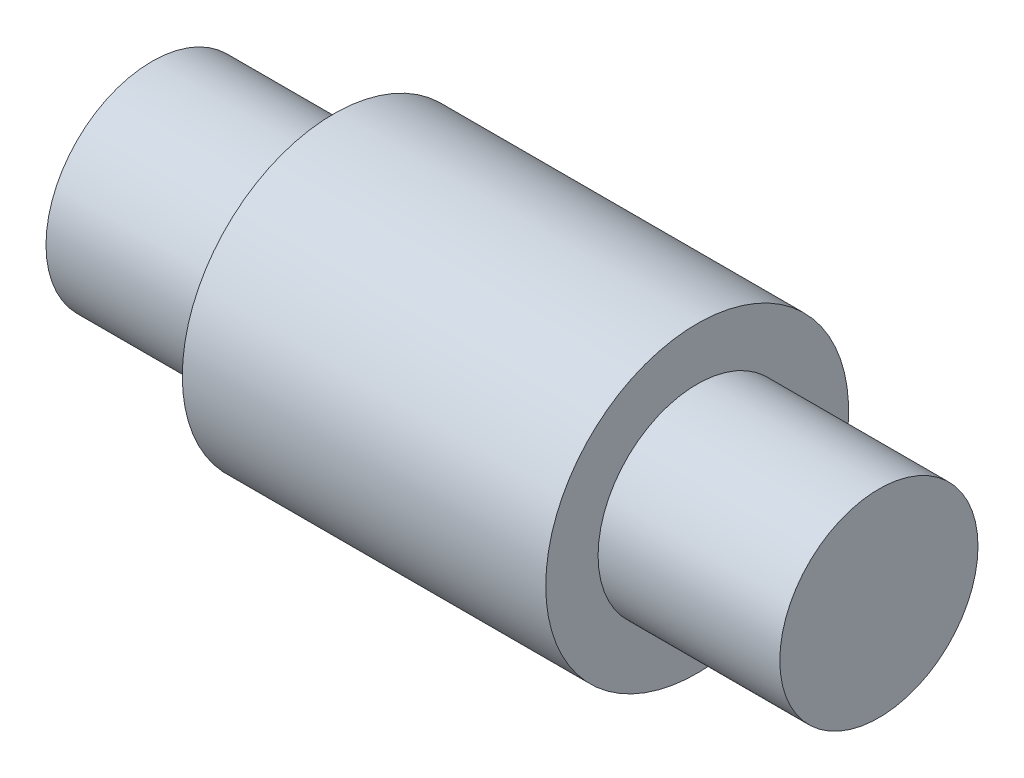
ISO-10303-21;
HEADER;
FILE_DESCRIPTION(('STEP AP214'),'2;1');
FILE_NAME('part.step','',(''),(''),'','','');
FILE_SCHEMA(('AUTOMOTIVE_DESIGN { 1 0 10303 214 1 1 1 1 }'));
ENDSEC;
DATA;
#1=APPLICATION_CONTEXT('core data for automotive mechanical design processes');
#2=APPLICATION_PROTOCOL_DEFINITION('international standard','automotive_design',2000,#1);
#3=PRODUCT_CONTEXT('',#1,'mechanical');
#4=PRODUCT('Part','Part','',(#3));
#5=PRODUCT_RELATED_PRODUCT_CATEGORY('part','',(#4));
#6=PRODUCT_DEFINITION_FORMATION('','',#4);
#7=PRODUCT_DEFINITION_CONTEXT('part definition',#1,'design');
#8=PRODUCT_DEFINITION('design','',#6,#7);
#9=PRODUCT_DEFINITION_SHAPE('','',#8);
#10=(LENGTH_UNIT() NAMED_UNIT(*) SI_UNIT(.MILLI.,.METRE.));
#11=(NAMED_UNIT(*) PLANE_ANGLE_UNIT() SI_UNIT($,.RADIAN.));
#12=(NAMED_UNIT(*) SI_UNIT($,.STERADIAN.) SOLID_ANGLE_UNIT());
#13=UNCERTAINTY_MEASURE_WITH_UNIT(LENGTH_MEASURE(1.E-05),#10,'distance_accuracy_value','');
#14=(GEOMETRIC_REPRESENTATION_CONTEXT(3) GLOBAL_UNCERTAINTY_ASSIGNED_CONTEXT((#13)) GLOBAL_UNIT_ASSIGNED_CONTEXT((#10,
#11,#12)) REPRESENTATION_CONTEXT('',''));
#15=CARTESIAN_POINT('',(0.,0.,0.));
#16=DIRECTION('',(0.,0.,1.));
#17=DIRECTION('',(1.,0.,0.));
#18=AXIS2_PLACEMENT_3D('',#15,#16,#17);
#19=CARTESIAN_POINT('',(-12.,0.,0.));
#20=DIRECTION('',(-1.,0.,0.));
#21=DIRECTION('',(0.,0.,1.));
#22=AXIS2_PLACEMENT_3D('',#19,#20,#21);
#23=CYLINDRICAL_SURFACE('',#22,5.);
#24=CARTESIAN_POINT('',(-6.,0.,0.));
#25=DIRECTION('',(-1.,0.,0.));
#26=DIRECTION('',(0.,0.,1.));
#27=AXIS2_PLACEMENT_3D('',#24,#25,#26);
#28=CIRCLE('',#27,5.);
#29=CARTESIAN_POINT('',(-6.,0.,5.));
#30=VERTEX_POINT('',#29);
#31=EDGE_CURVE('E56',#30,#30,#28,.T.);
#32=ORIENTED_EDGE('',*,*,#31,.F.);
#33=EDGE_LOOP('',(#32));
#34=FACE_BOUND('',#33,.T.);
#35=CARTESIAN_POINT('',(6.,0.,0.));
#36=DIRECTION('',(-1.,0.,0.));
#37=DIRECTION('',(0.,0.,1.));
#38=AXIS2_PLACEMENT_3D('',#35,#36,#37);
#39=CIRCLE('',#38,5.);
#40=CARTESIAN_POINT('',(6.,0.,5.));
#41=VERTEX_POINT('',#40);
#42=EDGE_CURVE('E10',#41,#41,#39,.T.);
#43=ORIENTED_EDGE('',*,*,#42,.T.);
#44=EDGE_LOOP('',(#43));
#45=FACE_BOUND('',#44,.T.);
#46=ADVANCED_FACE('F40',(#34,#45),#23,.T.);
#47=CARTESIAN_POINT('',(6.,5.,0.));
#48=DIRECTION('',(-1.,0.,0.));
#49=DIRECTION('',(0.,0.,1.));
#50=AXIS2_PLACEMENT_3D('',#47,#48,#49);
#51=PLANE('',#50);
#52=ORIENTED_EDGE('',*,*,#42,.F.);
#53=EDGE_LOOP('',(#52));
#54=FACE_BOUND('',#53,.T.);
#55=CARTESIAN_POINT('',(6.,0.,0.));
#56=DIRECTION('',(-1.,0.,0.));
#57=DIRECTION('',(0.,0.,1.));
#58=AXIS2_PLACEMENT_3D('',#55,#56,#57);
#59=CIRCLE('',#58,3.27206363672529);
#60=CARTESIAN_POINT('',(6.,0.,3.27206363672529));
#61=VERTEX_POINT('',#60);
#62=EDGE_CURVE('E43',#61,#61,#59,.T.);
#63=ORIENTED_EDGE('',*,*,#62,.T.);
#64=EDGE_LOOP('',(#63));
#65=FACE_BOUND('',#64,.T.);
#66=ADVANCED_FACE('F67',(#54,#65),#51,.F.);
#67=CARTESIAN_POINT('',(-12.,0.,0.));
#68=DIRECTION('',(-1.,0.,0.));
#69=DIRECTION('',(0.,0.,1.));
#70=AXIS2_PLACEMENT_3D('',#67,#68,#69);
#71=CYLINDRICAL_SURFACE('',#70,3.27206363672529);
#72=ORIENTED_EDGE('',*,*,#62,.F.);
#73=EDGE_LOOP('',(#72));
#74=FACE_BOUND('',#73,.T.);
#75=CARTESIAN_POINT('',(12.,0.,0.));
#76=DIRECTION('',(-1.,0.,0.));
#77=DIRECTION('',(0.,0.,1.));
#78=AXIS2_PLACEMENT_3D('',#75,#76,#77);
#79=CIRCLE('',#78,3.27206363672529);
#80=CARTESIAN_POINT('',(12.,0.,3.27206363672529));
#81=VERTEX_POINT('',#80);
#82=EDGE_CURVE('E50',#81,#81,#79,.T.);
#83=ORIENTED_EDGE('',*,*,#82,.T.);
#84=EDGE_LOOP('',(#83));
#85=FACE_BOUND('',#84,.T.);
#86=ADVANCED_FACE('F68',(#74,#85),#71,.T.);
#87=CARTESIAN_POINT('',(12.,3.27206363672529,0.));
#88=DIRECTION('',(-1.,0.,0.));
#89=DIRECTION('',(0.,0.,1.));
#90=AXIS2_PLACEMENT_3D('',#87,#88,#89);
#91=PLANE('',#90);
#92=ORIENTED_EDGE('',*,*,#82,.F.);
#93=EDGE_LOOP('',(#92));
#94=FACE_BOUND('',#93,.T.);
#95=ADVANCED_FACE('F75',(#94),#91,.F.);
#96=CARTESIAN_POINT('',(-12.,0.,0.));
#97=DIRECTION('',(1.,0.,0.));
#98=DIRECTION('',(0.,0.,-1.));
#99=AXIS2_PLACEMENT_3D('',#96,#97,#98);
#100=PLANE('',#99);
#101=CARTESIAN_POINT('',(-12.,0.,0.));
#102=DIRECTION('',(-1.,0.,0.));
#103=DIRECTION('',(0.,0.,1.));
#104=AXIS2_PLACEMENT_3D('',#101,#102,#103);
#105=CIRCLE('',#104,3.5);
#106=CARTESIAN_POINT('',(-12.,0.,3.5));
#107=VERTEX_POINT('',#106);
#108=EDGE_CURVE('E51',#107,#107,#105,.T.);
#109=ORIENTED_EDGE('',*,*,#108,.T.);
#110=EDGE_LOOP('',(#109));
#111=FACE_BOUND('',#110,.T.);
#112=ADVANCED_FACE('F83',(#111),#100,.F.);
#113=CARTESIAN_POINT('',(-12.,0.,0.));
#114=DIRECTION('',(-1.,0.,0.));
#115=DIRECTION('',(0.,0.,1.));
#116=AXIS2_PLACEMENT_3D('',#113,#114,#115);
#117=CYLINDRICAL_SURFACE('',#116,3.5);
#118=ORIENTED_EDGE('',*,*,#108,.F.);
#119=EDGE_LOOP('',(#118));
#120=FACE_BOUND('',#119,.T.);
#121=CARTESIAN_POINT('',(-6.,0.,0.));
#122=DIRECTION('',(-1.,0.,0.));
#123=DIRECTION('',(0.,0.,1.));
#124=AXIS2_PLACEMENT_3D('',#121,#122,#123);
#125=CIRCLE('',#124,3.5);
#126=CARTESIAN_POINT('',(-6.,0.,3.5));
#127=VERTEX_POINT('',#126);
#128=EDGE_CURVE('E57',#127,#127,#125,.T.);
#129=ORIENTED_EDGE('',*,*,#128,.T.);
#130=EDGE_LOOP('',(#129));
#131=FACE_BOUND('',#130,.T.);
#132=ADVANCED_FACE('F82',(#120,#131),#117,.T.);
#133=CARTESIAN_POINT('',(-6.,3.5,0.));
#134=DIRECTION('',(1.,0.,0.));
#135=DIRECTION('',(0.,0.,-1.));
#136=AXIS2_PLACEMENT_3D('',#133,#134,#135);
#137=PLANE('',#136);
#138=ORIENTED_EDGE('',*,*,#128,.F.);
#139=EDGE_LOOP('',(#138));
#140=FACE_BOUND('',#139,.T.);
#141=ORIENTED_EDGE('',*,*,#31,.T.);
#142=EDGE_LOOP('',(#141));
#143=FACE_BOUND('',#142,.T.);
#144=ADVANCED_FACE('F64',(#140,#143),#137,.F.);
#145=CLOSED_SHELL('',(#46,#66,#86,#95,#112,#132,#144));
#146=MANIFOLD_SOLID_BREP('B2',#145);
#147=ADVANCED_BREP_SHAPE_REPRESENTATION('',(#18,#146),#14);
#148=SHAPE_DEFINITION_REPRESENTATION(#9,#147);
ENDSEC;
END-ISO-10303-21;
